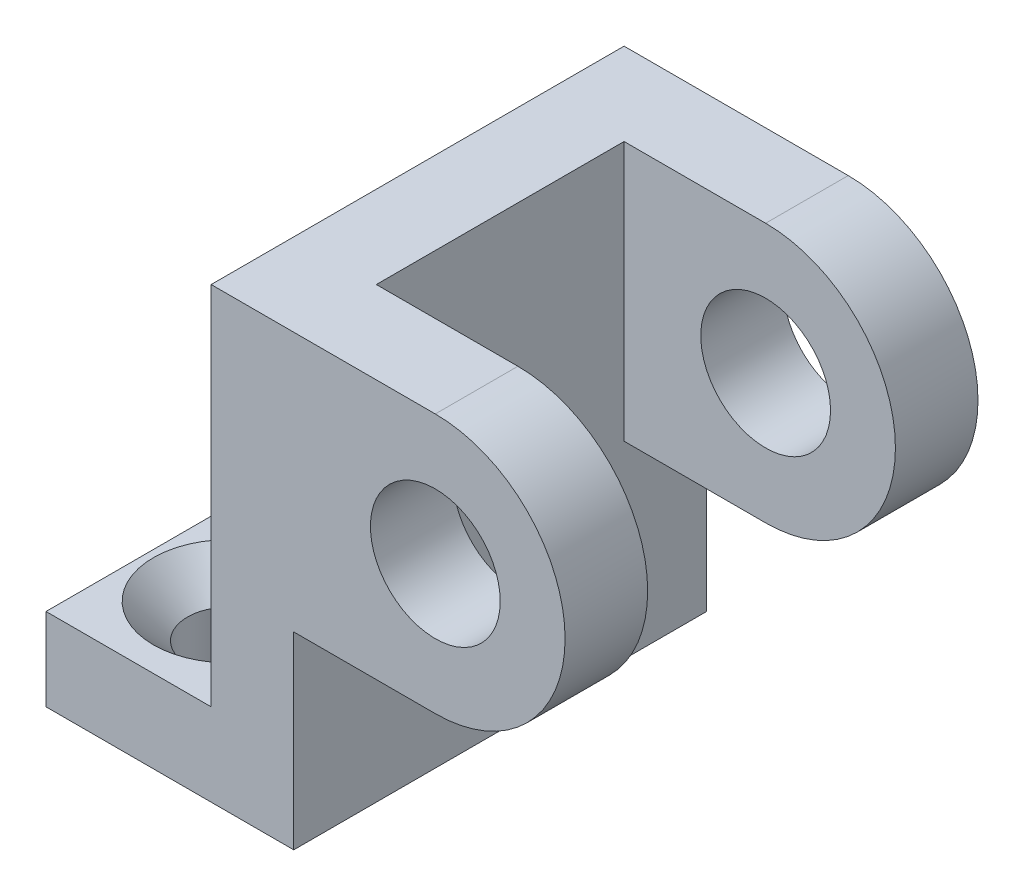
ISO-10303-21;
HEADER;
FILE_DESCRIPTION(('STEP AP214'),'2;1');
FILE_NAME('part.step','',(''),(''),'','','');
FILE_SCHEMA(('AUTOMOTIVE_DESIGN { 1 0 10303 214 1 1 1 1 }'));
ENDSEC;
DATA;
#1=APPLICATION_CONTEXT('core data for automotive mechanical design processes');
#2=APPLICATION_PROTOCOL_DEFINITION('international standard','automotive_design',2000,#1);
#3=PRODUCT_CONTEXT('',#1,'mechanical');
#4=PRODUCT('Part','Part','',(#3));
#5=PRODUCT_RELATED_PRODUCT_CATEGORY('part','',(#4));
#6=PRODUCT_DEFINITION_FORMATION('','',#4);
#7=PRODUCT_DEFINITION_CONTEXT('part definition',#1,'design');
#8=PRODUCT_DEFINITION('design','',#6,#7);
#9=PRODUCT_DEFINITION_SHAPE('','',#8);
#10=(LENGTH_UNIT() NAMED_UNIT(*) SI_UNIT(.MILLI.,.METRE.));
#11=(NAMED_UNIT(*) PLANE_ANGLE_UNIT() SI_UNIT($,.RADIAN.));
#12=(NAMED_UNIT(*) SI_UNIT($,.STERADIAN.) SOLID_ANGLE_UNIT());
#13=UNCERTAINTY_MEASURE_WITH_UNIT(LENGTH_MEASURE(1.E-05),#10,'distance_accuracy_value','');
#14=(GEOMETRIC_REPRESENTATION_CONTEXT(3) GLOBAL_UNCERTAINTY_ASSIGNED_CONTEXT((#13)) GLOBAL_UNIT_ASSIGNED_CONTEXT((#10,
#11,#12)) REPRESENTATION_CONTEXT('',''));
#15=CARTESIAN_POINT('',(0.,0.,0.));
#16=DIRECTION('',(0.,0.,1.));
#17=DIRECTION('',(1.,0.,0.));
#18=AXIS2_PLACEMENT_3D('',#15,#16,#17);
#19=CARTESIAN_POINT('',(14.,38.,-17.5));
#20=DIRECTION('',(-1.,0.,0.));
#21=DIRECTION('',(0.,0.,1.));
#22=AXIS2_PLACEMENT_3D('',#19,#20,#21);
#23=PLANE('',#22);
#24=DIRECTION('',(0.,-1.,0.));
#25=VECTOR('',#24,1.);
#26=CARTESIAN_POINT('',(14.,16.,-10.5));
#27=LINE('',#26,#25);
#28=CARTESIAN_POINT('',(14.,38.,-10.5));
#29=VERTEX_POINT('',#28);
#30=CARTESIAN_POINT('',(14.,16.,-10.5));
#31=VERTEX_POINT('',#30);
#32=EDGE_CURVE('E142',#29,#31,#27,.T.);
#33=ORIENTED_EDGE('',*,*,#32,.F.);
#34=DIRECTION('',(0.,0.,-1.));
#35=VECTOR('',#34,1.);
#36=CARTESIAN_POINT('',(14.,38.,-17.5));
#37=LINE('',#36,#35);
#38=CARTESIAN_POINT('',(14.,38.,10.5));
#39=VERTEX_POINT('',#38);
#40=EDGE_CURVE('E154',#39,#29,#37,.T.);
#41=ORIENTED_EDGE('',*,*,#40,.F.);
#42=DIRECTION('',(0.,-1.,0.));
#43=VECTOR('',#42,1.);
#44=CARTESIAN_POINT('',(14.,16.,10.5));
#45=LINE('',#44,#43);
#46=CARTESIAN_POINT('',(14.,16.,10.5));
#47=VERTEX_POINT('',#46);
#48=EDGE_CURVE('E241',#39,#47,#45,.T.);
#49=ORIENTED_EDGE('',*,*,#48,.T.);
#50=DIRECTION('',(0.,0.,1.));
#51=VECTOR('',#50,1.);
#52=CARTESIAN_POINT('',(14.,16.,10.5));
#53=LINE('',#52,#51);
#54=CARTESIAN_POINT('',(14.,16.,17.5));
#55=VERTEX_POINT('',#54);
#56=EDGE_CURVE('E173',#47,#55,#53,.T.);
#57=ORIENTED_EDGE('',*,*,#56,.T.);
#58=DIRECTION('',(0.,-1.,0.));
#59=VECTOR('',#58,1.);
#60=CARTESIAN_POINT('',(14.,38.,17.5));
#61=LINE('',#60,#59);
#62=CARTESIAN_POINT('',(14.,0.,17.5));
#63=VERTEX_POINT('',#62);
#64=EDGE_CURVE('E178',#55,#63,#61,.T.);
#65=ORIENTED_EDGE('',*,*,#64,.T.);
#66=DIRECTION('',(0.,0.,-1.));
#67=VECTOR('',#66,1.);
#68=CARTESIAN_POINT('',(14.,0.,-17.5));
#69=LINE('',#68,#67);
#70=CARTESIAN_POINT('',(14.,0.,-17.5));
#71=VERTEX_POINT('',#70);
#72=EDGE_CURVE('E165',#63,#71,#69,.T.);
#73=ORIENTED_EDGE('',*,*,#72,.T.);
#74=DIRECTION('',(0.,-1.,0.));
#75=VECTOR('',#74,1.);
#76=CARTESIAN_POINT('',(14.,38.,-17.5));
#77=LINE('',#76,#75);
#78=CARTESIAN_POINT('',(14.,16.,-17.5));
#79=VERTEX_POINT('',#78);
#80=EDGE_CURVE('E185',#79,#71,#77,.T.);
#81=ORIENTED_EDGE('',*,*,#80,.F.);
#82=DIRECTION('',(0.,0.,-1.));
#83=VECTOR('',#82,1.);
#84=CARTESIAN_POINT('',(14.,16.,-10.5));
#85=LINE('',#84,#83);
#86=EDGE_CURVE('E157',#31,#79,#85,.T.);
#87=ORIENTED_EDGE('',*,*,#86,.F.);
#88=EDGE_LOOP('',(#33,#41,#49,#57,#65,#73,#81,#87));
#89=FACE_BOUND('',#88,.T.);
#90=ADVANCED_FACE('F39',(#89),#23,.F.);
#91=CARTESIAN_POINT('',(-7.,7.,17.5));
#92=DIRECTION('',(1.,0.,0.));
#93=DIRECTION('',(0.,0.,-1.));
#94=AXIS2_PLACEMENT_3D('',#91,#92,#93);
#95=PLANE('',#94);
#96=DIRECTION('',(0.,0.,1.));
#97=VECTOR('',#96,1.);
#98=CARTESIAN_POINT('',(-7.,0.,17.5));
#99=LINE('',#98,#97);
#100=CARTESIAN_POINT('',(-7.,0.,-17.5));
#101=VERTEX_POINT('',#100);
#102=CARTESIAN_POINT('',(-7.,0.,17.5));
#103=VERTEX_POINT('',#102);
#104=EDGE_CURVE('E205',#101,#103,#99,.T.);
#105=ORIENTED_EDGE('',*,*,#104,.T.);
#106=DIRECTION('',(0.,-1.,0.));
#107=VECTOR('',#106,1.);
#108=CARTESIAN_POINT('',(-7.,7.,17.5));
#109=LINE('',#108,#107);
#110=CARTESIAN_POINT('',(-7.,7.,17.5));
#111=VERTEX_POINT('',#110);
#112=EDGE_CURVE('E11',#111,#103,#109,.T.);
#113=ORIENTED_EDGE('',*,*,#112,.F.);
#114=DIRECTION('',(0.,0.,1.));
#115=VECTOR('',#114,1.);
#116=CARTESIAN_POINT('',(-7.,7.,17.5));
#117=LINE('',#116,#115);
#118=CARTESIAN_POINT('',(-7.,7.,-17.5));
#119=VERTEX_POINT('',#118);
#120=EDGE_CURVE('E206',#119,#111,#117,.T.);
#121=ORIENTED_EDGE('',*,*,#120,.F.);
#122=DIRECTION('',(0.,-1.,0.));
#123=VECTOR('',#122,1.);
#124=CARTESIAN_POINT('',(-7.,7.,-17.5));
#125=LINE('',#124,#123);
#126=EDGE_CURVE('E47',#119,#101,#125,.T.);
#127=ORIENTED_EDGE('',*,*,#126,.T.);
#128=EDGE_LOOP('',(#105,#113,#121,#127));
#129=FACE_BOUND('',#128,.T.);
#130=ADVANCED_FACE('F41',(#129),#95,.F.);
#131=CARTESIAN_POINT('',(7.,7.,17.5));
#132=DIRECTION('',(0.,0.,-1.));
#133=DIRECTION('',(-1.,0.,0.));
#134=AXIS2_PLACEMENT_3D('',#131,#132,#133);
#135=PLANE('',#134);
#136=DIRECTION('',(1.,0.,0.));
#137=VECTOR('',#136,1.);
#138=CARTESIAN_POINT('',(7.,0.,17.5));
#139=LINE('',#138,#137);
#140=EDGE_CURVE('E214',#103,#63,#139,.T.);
#141=ORIENTED_EDGE('',*,*,#140,.T.);
#142=ORIENTED_EDGE('',*,*,#64,.F.);
#143=DIRECTION('',(1.,0.,0.));
#144=VECTOR('',#143,1.);
#145=CARTESIAN_POINT('',(14.,16.,17.5));
#146=LINE('',#145,#144);
#147=CARTESIAN_POINT('',(26.,16.,17.5));
#148=VERTEX_POINT('',#147);
#149=EDGE_CURVE('E54',#55,#148,#146,.T.);
#150=ORIENTED_EDGE('',*,*,#149,.T.);
#151=CARTESIAN_POINT('',(26.,27.,17.5));
#152=DIRECTION('',(0.,0.,1.));
#153=DIRECTION('',(1.,0.,0.));
#154=AXIS2_PLACEMENT_3D('',#151,#152,#153);
#155=CIRCLE('',#154,11.);
#156=CARTESIAN_POINT('',(26.,38.,17.5));
#157=VERTEX_POINT('',#156);
#158=EDGE_CURVE('E244',#148,#157,#155,.T.);
#159=ORIENTED_EDGE('',*,*,#158,.T.);
#160=DIRECTION('',(1.,0.,0.));
#161=VECTOR('',#160,1.);
#162=CARTESIAN_POINT('',(7.,38.,17.5));
#163=LINE('',#162,#161);
#164=CARTESIAN_POINT('',(7.,38.,17.5));
#165=VERTEX_POINT('',#164);
#166=EDGE_CURVE('E177',#165,#157,#163,.T.);
#167=ORIENTED_EDGE('',*,*,#166,.F.);
#168=DIRECTION('',(0.,-1.,0.));
#169=VECTOR('',#168,1.);
#170=CARTESIAN_POINT('',(7.,38.,17.5));
#171=LINE('',#170,#169);
#172=CARTESIAN_POINT('',(7.,7.,17.5));
#173=VERTEX_POINT('',#172);
#174=EDGE_CURVE('E181',#165,#173,#171,.T.);
#175=ORIENTED_EDGE('',*,*,#174,.T.);
#176=DIRECTION('',(1.,0.,0.));
#177=VECTOR('',#176,1.);
#178=CARTESIAN_POINT('',(7.,7.,17.5));
#179=LINE('',#178,#177);
#180=EDGE_CURVE('E84',#111,#173,#179,.T.);
#181=ORIENTED_EDGE('',*,*,#180,.F.);
#182=ORIENTED_EDGE('',*,*,#112,.T.);
#183=EDGE_LOOP('',(#141,#142,#150,#159,#167,#175,#181,#182));
#184=FACE_BOUND('',#183,.T.);
#185=CARTESIAN_POINT('',(26.,27.,17.5));
#186=DIRECTION('',(0.,0.,1.));
#187=DIRECTION('',(1.,0.,0.));
#188=AXIS2_PLACEMENT_3D('',#185,#186,#187);
#189=CIRCLE('',#188,5.5);
#190=CARTESIAN_POINT('',(31.5,27.,17.5));
#191=VERTEX_POINT('',#190);
#192=EDGE_CURVE('E231',#191,#191,#189,.T.);
#193=ORIENTED_EDGE('',*,*,#192,.F.);
#194=EDGE_LOOP('',(#193));
#195=FACE_BOUND('',#194,.T.);
#196=ADVANCED_FACE('F225',(#184,#195),#135,.F.);
#197=CARTESIAN_POINT('',(7.,7.,-17.5));
#198=DIRECTION('',(0.,0.,1.));
#199=DIRECTION('',(1.,0.,0.));
#200=AXIS2_PLACEMENT_3D('',#197,#198,#199);
#201=PLANE('',#200);
#202=DIRECTION('',(-1.,0.,0.));
#203=VECTOR('',#202,1.);
#204=CARTESIAN_POINT('',(7.,0.,-17.5));
#205=LINE('',#204,#203);
#206=EDGE_CURVE('E78',#71,#101,#205,.T.);
#207=ORIENTED_EDGE('',*,*,#206,.T.);
#208=ORIENTED_EDGE('',*,*,#126,.F.);
#209=DIRECTION('',(-1.,0.,0.));
#210=VECTOR('',#209,1.);
#211=CARTESIAN_POINT('',(7.,7.,-17.5));
#212=LINE('',#211,#210);
#213=CARTESIAN_POINT('',(7.,7.,-17.5));
#214=VERTEX_POINT('',#213);
#215=EDGE_CURVE('E63',#214,#119,#212,.T.);
#216=ORIENTED_EDGE('',*,*,#215,.F.);
#217=DIRECTION('',(0.,-1.,0.));
#218=VECTOR('',#217,1.);
#219=CARTESIAN_POINT('',(7.,38.,-17.5));
#220=LINE('',#219,#218);
#221=CARTESIAN_POINT('',(7.,38.,-17.5));
#222=VERTEX_POINT('',#221);
#223=EDGE_CURVE('E183',#222,#214,#220,.T.);
#224=ORIENTED_EDGE('',*,*,#223,.F.);
#225=DIRECTION('',(-1.,0.,0.));
#226=VECTOR('',#225,1.);
#227=CARTESIAN_POINT('',(7.,38.,-17.5));
#228=LINE('',#227,#226);
#229=CARTESIAN_POINT('',(26.,38.,-17.5));
#230=VERTEX_POINT('',#229);
#231=EDGE_CURVE('E164',#230,#222,#228,.T.);
#232=ORIENTED_EDGE('',*,*,#231,.F.);
#233=CARTESIAN_POINT('',(26.,27.,-17.5));
#234=DIRECTION('',(0.,0.,1.));
#235=DIRECTION('',(1.,0.,0.));
#236=AXIS2_PLACEMENT_3D('',#233,#234,#235);
#237=CIRCLE('',#236,11.);
#238=CARTESIAN_POINT('',(26.,16.,-17.5));
#239=VERTEX_POINT('',#238);
#240=EDGE_CURVE('E271',#239,#230,#237,.T.);
#241=ORIENTED_EDGE('',*,*,#240,.F.);
#242=DIRECTION('',(1.,0.,0.));
#243=VECTOR('',#242,1.);
#244=CARTESIAN_POINT('',(14.,16.,-17.5));
#245=LINE('',#244,#243);
#246=EDGE_CURVE('E158',#79,#239,#245,.T.);
#247=ORIENTED_EDGE('',*,*,#246,.F.);
#248=ORIENTED_EDGE('',*,*,#80,.T.);
#249=EDGE_LOOP('',(#207,#208,#216,#224,#232,#241,#247,#248));
#250=FACE_BOUND('',#249,.T.);
#251=CARTESIAN_POINT('',(26.,27.,-17.5));
#252=DIRECTION('',(0.,0.,1.));
#253=DIRECTION('',(1.,0.,0.));
#254=AXIS2_PLACEMENT_3D('',#251,#252,#253);
#255=CIRCLE('',#254,5.5);
#256=CARTESIAN_POINT('',(31.5,27.,-17.5));
#257=VERTEX_POINT('',#256);
#258=EDGE_CURVE('E285',#257,#257,#255,.T.);
#259=ORIENTED_EDGE('',*,*,#258,.T.);
#260=EDGE_LOOP('',(#259));
#261=FACE_BOUND('',#260,.T.);
#262=ADVANCED_FACE('F228',(#250,#261),#201,.F.);
#263=CARTESIAN_POINT('',(0.,7.,0.));
#264=DIRECTION('',(0.,1.,0.));
#265=DIRECTION('',(0.,0.,1.));
#266=AXIS2_PLACEMENT_3D('',#263,#264,#265);
#267=PLANE('',#266);
#268=CARTESIAN_POINT('',(0.,7.,-9.));
#269=DIRECTION('',(0.,1.,0.));
#270=DIRECTION('',(0.,0.,1.));
#271=AXIS2_PLACEMENT_3D('',#268,#269,#270);
#272=CIRCLE('',#271,6.4);
#273=CARTESIAN_POINT('',(0.,7.,-2.6));
#274=VERTEX_POINT('',#273);
#275=EDGE_CURVE('E187',#274,#274,#272,.T.);
#276=ORIENTED_EDGE('',*,*,#275,.F.);
#277=EDGE_LOOP('',(#276));
#278=FACE_BOUND('',#277,.T.);
#279=CARTESIAN_POINT('',(0.,7.,9.));
#280=DIRECTION('',(0.,1.,0.));
#281=DIRECTION('',(0.,0.,1.));
#282=AXIS2_PLACEMENT_3D('',#279,#280,#281);
#283=CIRCLE('',#282,6.4);
#284=CARTESIAN_POINT('',(0.,7.,15.4));
#285=VERTEX_POINT('',#284);
#286=EDGE_CURVE('E196',#285,#285,#283,.T.);
#287=ORIENTED_EDGE('',*,*,#286,.F.);
#288=EDGE_LOOP('',(#287));
#289=FACE_BOUND('',#288,.T.);
#290=ORIENTED_EDGE('',*,*,#120,.T.);
#291=ORIENTED_EDGE('',*,*,#180,.T.);
#292=DIRECTION('',(0.,0.,-1.));
#293=VECTOR('',#292,1.);
#294=CARTESIAN_POINT('',(7.,7.,17.5));
#295=LINE('',#294,#293);
#296=EDGE_CURVE('E209',#173,#214,#295,.T.);
#297=ORIENTED_EDGE('',*,*,#296,.T.);
#298=ORIENTED_EDGE('',*,*,#215,.T.);
#299=EDGE_LOOP('',(#290,#291,#297,#298));
#300=FACE_BOUND('',#299,.T.);
#301=ADVANCED_FACE('F267',(#278,#289,#300),#267,.T.);
#302=CARTESIAN_POINT('',(0.,0.,0.));
#303=DIRECTION('',(0.,1.,0.));
#304=DIRECTION('',(0.,0.,1.));
#305=AXIS2_PLACEMENT_3D('',#302,#303,#304);
#306=PLANE('',#305);
#307=CARTESIAN_POINT('',(0.,0.,-9.));
#308=DIRECTION('',(0.,1.,0.));
#309=DIRECTION('',(0.,0.,1.));
#310=AXIS2_PLACEMENT_3D('',#307,#308,#309);
#311=CIRCLE('',#310,3.5);
#312=CARTESIAN_POINT('',(0.,0.,-5.5));
#313=VERTEX_POINT('',#312);
#314=EDGE_CURVE('E193',#313,#313,#311,.T.);
#315=ORIENTED_EDGE('',*,*,#314,.T.);
#316=EDGE_LOOP('',(#315));
#317=FACE_BOUND('',#316,.T.);
#318=CARTESIAN_POINT('',(0.,0.,9.));
#319=DIRECTION('',(0.,1.,0.));
#320=DIRECTION('',(0.,0.,1.));
#321=AXIS2_PLACEMENT_3D('',#318,#319,#320);
#322=CIRCLE('',#321,3.5);
#323=CARTESIAN_POINT('',(0.,0.,12.5));
#324=VERTEX_POINT('',#323);
#325=EDGE_CURVE('E202',#324,#324,#322,.T.);
#326=ORIENTED_EDGE('',*,*,#325,.T.);
#327=EDGE_LOOP('',(#326));
#328=FACE_BOUND('',#327,.T.);
#329=ORIENTED_EDGE('',*,*,#104,.F.);
#330=ORIENTED_EDGE('',*,*,#206,.F.);
#331=ORIENTED_EDGE('',*,*,#72,.F.);
#332=ORIENTED_EDGE('',*,*,#140,.F.);
#333=EDGE_LOOP('',(#329,#330,#331,#332));
#334=FACE_BOUND('',#333,.T.);
#335=ADVANCED_FACE('F222',(#317,#328,#334),#306,.F.);
#336=CARTESIAN_POINT('',(0.,7.,9.));
#337=DIRECTION('',(0.,1.,0.));
#338=DIRECTION('',(0.,0.,1.));
#339=AXIS2_PLACEMENT_3D('',#336,#337,#338);
#340=CYLINDRICAL_SURFACE('',#339,3.5);
#341=ORIENTED_EDGE('',*,*,#325,.F.);
#342=EDGE_LOOP('',(#341));
#343=FACE_BOUND('',#342,.T.);
#344=CARTESIAN_POINT('',(0.,4.1,9.));
#345=DIRECTION('',(0.,1.,0.));
#346=DIRECTION('',(0.,0.,1.));
#347=AXIS2_PLACEMENT_3D('',#344,#345,#346);
#348=CIRCLE('',#347,3.5);
#349=CARTESIAN_POINT('',(0.,4.1,12.5));
#350=VERTEX_POINT('',#349);
#351=EDGE_CURVE('E199',#350,#350,#348,.T.);
#352=ORIENTED_EDGE('',*,*,#351,.T.);
#353=EDGE_LOOP('',(#352));
#354=FACE_BOUND('',#353,.T.);
#355=ADVANCED_FACE('F326',(#343,#354),#340,.F.);
#356=CARTESIAN_POINT('',(0.,7.,9.));
#357=DIRECTION('',(0.,1.,0.));
#358=DIRECTION('',(0.,0.,1.));
#359=AXIS2_PLACEMENT_3D('',#356,#357,#358);
#360=CONICAL_SURFACE('',#359,6.4,0.785398163397448);
#361=ORIENTED_EDGE('',*,*,#351,.F.);
#362=EDGE_LOOP('',(#361));
#363=FACE_BOUND('',#362,.T.);
#364=ORIENTED_EDGE('',*,*,#286,.T.);
#365=EDGE_LOOP('',(#364));
#366=FACE_BOUND('',#365,.T.);
#367=ADVANCED_FACE('F322',(#363,#366),#360,.F.);
#368=CARTESIAN_POINT('',(0.,7.,-9.));
#369=DIRECTION('',(0.,1.,0.));
#370=DIRECTION('',(0.,0.,1.));
#371=AXIS2_PLACEMENT_3D('',#368,#369,#370);
#372=CYLINDRICAL_SURFACE('',#371,3.5);
#373=ORIENTED_EDGE('',*,*,#314,.F.);
#374=EDGE_LOOP('',(#373));
#375=FACE_BOUND('',#374,.T.);
#376=CARTESIAN_POINT('',(0.,4.1,-9.));
#377=DIRECTION('',(0.,1.,0.));
#378=DIRECTION('',(0.,0.,1.));
#379=AXIS2_PLACEMENT_3D('',#376,#377,#378);
#380=CIRCLE('',#379,3.5);
#381=CARTESIAN_POINT('',(0.,4.1,-5.5));
#382=VERTEX_POINT('',#381);
#383=EDGE_CURVE('E190',#382,#382,#380,.T.);
#384=ORIENTED_EDGE('',*,*,#383,.T.);
#385=EDGE_LOOP('',(#384));
#386=FACE_BOUND('',#385,.T.);
#387=ADVANCED_FACE('F318',(#375,#386),#372,.F.);
#388=CARTESIAN_POINT('',(0.,7.,-9.));
#389=DIRECTION('',(0.,1.,0.));
#390=DIRECTION('',(0.,0.,1.));
#391=AXIS2_PLACEMENT_3D('',#388,#389,#390);
#392=CONICAL_SURFACE('',#391,6.4,0.785398163397448);
#393=ORIENTED_EDGE('',*,*,#383,.F.);
#394=EDGE_LOOP('',(#393));
#395=FACE_BOUND('',#394,.T.);
#396=ORIENTED_EDGE('',*,*,#275,.T.);
#397=EDGE_LOOP('',(#396));
#398=FACE_BOUND('',#397,.T.);
#399=ADVANCED_FACE('F315',(#395,#398),#392,.F.);
#400=CARTESIAN_POINT('',(7.,38.,-17.5));
#401=DIRECTION('',(1.,0.,0.));
#402=DIRECTION('',(0.,0.,-1.));
#403=AXIS2_PLACEMENT_3D('',#400,#401,#402);
#404=PLANE('',#403);
#405=ORIENTED_EDGE('',*,*,#296,.F.);
#406=ORIENTED_EDGE('',*,*,#174,.F.);
#407=DIRECTION('',(0.,0.,1.));
#408=VECTOR('',#407,1.);
#409=CARTESIAN_POINT('',(7.,38.,-17.5));
#410=LINE('',#409,#408);
#411=EDGE_CURVE('E167',#222,#165,#410,.T.);
#412=ORIENTED_EDGE('',*,*,#411,.F.);
#413=ORIENTED_EDGE('',*,*,#223,.T.);
#414=EDGE_LOOP('',(#405,#406,#412,#413));
#415=FACE_BOUND('',#414,.T.);
#416=ADVANCED_FACE('F266',(#415),#404,.F.);
#417=CARTESIAN_POINT('',(0.,38.,0.));
#418=DIRECTION('',(0.,1.,0.));
#419=DIRECTION('',(0.,0.,1.));
#420=AXIS2_PLACEMENT_3D('',#417,#418,#419);
#421=PLANE('',#420);
#422=ORIENTED_EDGE('',*,*,#166,.T.);
#423=DIRECTION('',(0.,0.,1.));
#424=VECTOR('',#423,1.);
#425=CARTESIAN_POINT('',(26.,38.,10.5));
#426=LINE('',#425,#424);
#427=CARTESIAN_POINT('',(26.,38.,10.5));
#428=VERTEX_POINT('',#427);
#429=EDGE_CURVE('E170',#428,#157,#426,.T.);
#430=ORIENTED_EDGE('',*,*,#429,.F.);
#431=DIRECTION('',(-1.,0.,0.));
#432=VECTOR('',#431,1.);
#433=CARTESIAN_POINT('',(14.,38.,10.5));
#434=LINE('',#433,#432);
#435=EDGE_CURVE('E163',#428,#39,#434,.T.);
#436=ORIENTED_EDGE('',*,*,#435,.T.);
#437=ORIENTED_EDGE('',*,*,#40,.T.);
#438=DIRECTION('',(-1.,0.,0.));
#439=VECTOR('',#438,1.);
#440=CARTESIAN_POINT('',(14.,38.,-10.5));
#441=LINE('',#440,#439);
#442=CARTESIAN_POINT('',(26.,38.,-10.5));
#443=VERTEX_POINT('',#442);
#444=EDGE_CURVE('E138',#443,#29,#441,.T.);
#445=ORIENTED_EDGE('',*,*,#444,.F.);
#446=DIRECTION('',(0.,0.,-1.));
#447=VECTOR('',#446,1.);
#448=CARTESIAN_POINT('',(26.,38.,-10.5));
#449=LINE('',#448,#447);
#450=EDGE_CURVE('E275',#443,#230,#449,.T.);
#451=ORIENTED_EDGE('',*,*,#450,.T.);
#452=ORIENTED_EDGE('',*,*,#231,.T.);
#453=ORIENTED_EDGE('',*,*,#411,.T.);
#454=EDGE_LOOP('',(#422,#430,#436,#437,#445,#451,#452,#453));
#455=FACE_BOUND('',#454,.T.);
#456=ADVANCED_FACE('F161',(#455),#421,.T.);
#457=CARTESIAN_POINT('',(26.,27.,10.5));
#458=DIRECTION('',(0.,0.,1.));
#459=DIRECTION('',(1.,0.,0.));
#460=AXIS2_PLACEMENT_3D('',#457,#458,#459);
#461=CYLINDRICAL_SURFACE('',#460,11.);
#462=ORIENTED_EDGE('',*,*,#158,.F.);
#463=DIRECTION('',(0.,0.,1.));
#464=VECTOR('',#463,1.);
#465=CARTESIAN_POINT('',(26.,16.,10.5));
#466=LINE('',#465,#464);
#467=CARTESIAN_POINT('',(26.,16.,10.5));
#468=VERTEX_POINT('',#467);
#469=EDGE_CURVE('E255',#468,#148,#466,.T.);
#470=ORIENTED_EDGE('',*,*,#469,.F.);
#471=CARTESIAN_POINT('',(26.,27.,10.5));
#472=DIRECTION('',(0.,0.,1.));
#473=DIRECTION('',(1.,0.,0.));
#474=AXIS2_PLACEMENT_3D('',#471,#472,#473);
#475=CIRCLE('',#474,11.);
#476=EDGE_CURVE('E247',#468,#428,#475,.T.);
#477=ORIENTED_EDGE('',*,*,#476,.T.);
#478=ORIENTED_EDGE('',*,*,#429,.T.);
#479=EDGE_LOOP('',(#462,#470,#477,#478));
#480=FACE_BOUND('',#479,.T.);
#481=ADVANCED_FACE('F260',(#480),#461,.T.);
#482=CARTESIAN_POINT('',(14.,16.,10.5));
#483=DIRECTION('',(0.,-1.,0.));
#484=DIRECTION('',(0.,0.,-1.));
#485=AXIS2_PLACEMENT_3D('',#482,#483,#484);
#486=PLANE('',#485);
#487=ORIENTED_EDGE('',*,*,#149,.F.);
#488=ORIENTED_EDGE('',*,*,#56,.F.);
#489=DIRECTION('',(1.,0.,0.));
#490=VECTOR('',#489,1.);
#491=CARTESIAN_POINT('',(14.,16.,10.5));
#492=LINE('',#491,#490);
#493=EDGE_CURVE('E243',#47,#468,#492,.T.);
#494=ORIENTED_EDGE('',*,*,#493,.T.);
#495=ORIENTED_EDGE('',*,*,#469,.T.);
#496=EDGE_LOOP('',(#487,#488,#494,#495));
#497=FACE_BOUND('',#496,.T.);
#498=ADVANCED_FACE('F383',(#497),#486,.T.);
#499=CARTESIAN_POINT('',(26.,27.,10.5));
#500=DIRECTION('',(0.,0.,1.));
#501=DIRECTION('',(1.,0.,0.));
#502=AXIS2_PLACEMENT_3D('',#499,#500,#501);
#503=PLANE('',#502);
#504=CARTESIAN_POINT('',(26.,27.,10.5));
#505=DIRECTION('',(0.,0.,1.));
#506=DIRECTION('',(1.,0.,0.));
#507=AXIS2_PLACEMENT_3D('',#504,#505,#506);
#508=CIRCLE('',#507,5.5);
#509=CARTESIAN_POINT('',(31.5,27.,10.5));
#510=VERTEX_POINT('',#509);
#511=EDGE_CURVE('E233',#510,#510,#508,.T.);
#512=ORIENTED_EDGE('',*,*,#511,.T.);
#513=EDGE_LOOP('',(#512));
#514=FACE_BOUND('',#513,.T.);
#515=ORIENTED_EDGE('',*,*,#48,.F.);
#516=ORIENTED_EDGE('',*,*,#435,.F.);
#517=ORIENTED_EDGE('',*,*,#476,.F.);
#518=ORIENTED_EDGE('',*,*,#493,.F.);
#519=EDGE_LOOP('',(#515,#516,#517,#518));
#520=FACE_BOUND('',#519,.T.);
#521=ADVANCED_FACE('F303',(#514,#520),#503,.F.);
#522=CARTESIAN_POINT('',(26.,27.,10.5));
#523=DIRECTION('',(0.,0.,1.));
#524=DIRECTION('',(1.,0.,0.));
#525=AXIS2_PLACEMENT_3D('',#522,#523,#524);
#526=CYLINDRICAL_SURFACE('',#525,5.5);
#527=ORIENTED_EDGE('',*,*,#511,.F.);
#528=EDGE_LOOP('',(#527));
#529=FACE_BOUND('',#528,.T.);
#530=ORIENTED_EDGE('',*,*,#192,.T.);
#531=EDGE_LOOP('',(#530));
#532=FACE_BOUND('',#531,.T.);
#533=ADVANCED_FACE('F295',(#529,#532),#526,.F.);
#534=CARTESIAN_POINT('',(26.,27.,-10.5));
#535=DIRECTION('',(0.,0.,-1.));
#536=DIRECTION('',(1.,0.,0.));
#537=AXIS2_PLACEMENT_3D('',#534,#535,#536);
#538=PLANE('',#537);
#539=ORIENTED_EDGE('',*,*,#32,.T.);
#540=DIRECTION('',(1.,0.,0.));
#541=VECTOR('',#540,1.);
#542=CARTESIAN_POINT('',(14.,16.,-10.5));
#543=LINE('',#542,#541);
#544=CARTESIAN_POINT('',(26.,16.,-10.5));
#545=VERTEX_POINT('',#544);
#546=EDGE_CURVE('E279',#31,#545,#543,.T.);
#547=ORIENTED_EDGE('',*,*,#546,.T.);
#548=CARTESIAN_POINT('',(26.,27.,-10.5));
#549=DIRECTION('',(0.,0.,1.));
#550=DIRECTION('',(1.,0.,0.));
#551=AXIS2_PLACEMENT_3D('',#548,#549,#550);
#552=CIRCLE('',#551,11.);
#553=EDGE_CURVE('E145',#545,#443,#552,.T.);
#554=ORIENTED_EDGE('',*,*,#553,.T.);
#555=ORIENTED_EDGE('',*,*,#444,.T.);
#556=EDGE_LOOP('',(#539,#547,#554,#555));
#557=FACE_BOUND('',#556,.T.);
#558=CARTESIAN_POINT('',(26.,27.,-10.5));
#559=DIRECTION('',(0.,0.,1.));
#560=DIRECTION('',(1.,0.,0.));
#561=AXIS2_PLACEMENT_3D('',#558,#559,#560);
#562=CIRCLE('',#561,5.5);
#563=CARTESIAN_POINT('',(31.5,27.,-10.5));
#564=VERTEX_POINT('',#563);
#565=EDGE_CURVE('E277',#564,#564,#562,.T.);
#566=ORIENTED_EDGE('',*,*,#565,.F.);
#567=EDGE_LOOP('',(#566));
#568=FACE_BOUND('',#567,.T.);
#569=ADVANCED_FACE('F140',(#557,#568),#538,.F.);
#570=CARTESIAN_POINT('',(14.,16.,-10.5));
#571=DIRECTION('',(0.,1.,0.));
#572=DIRECTION('',(0.,0.,1.));
#573=AXIS2_PLACEMENT_3D('',#570,#571,#572);
#574=PLANE('',#573);
#575=ORIENTED_EDGE('',*,*,#246,.T.);
#576=DIRECTION('',(0.,0.,-1.));
#577=VECTOR('',#576,1.);
#578=CARTESIAN_POINT('',(26.,16.,-10.5));
#579=LINE('',#578,#577);
#580=EDGE_CURVE('E237',#545,#239,#579,.T.);
#581=ORIENTED_EDGE('',*,*,#580,.F.);
#582=ORIENTED_EDGE('',*,*,#546,.F.);
#583=ORIENTED_EDGE('',*,*,#86,.T.);
#584=EDGE_LOOP('',(#575,#581,#582,#583));
#585=FACE_BOUND('',#584,.T.);
#586=ADVANCED_FACE('F294',(#585),#574,.F.);
#587=CARTESIAN_POINT('',(26.,27.,-10.5));
#588=DIRECTION('',(0.,0.,-1.));
#589=DIRECTION('',(-1.,0.,0.));
#590=AXIS2_PLACEMENT_3D('',#587,#588,#589);
#591=CYLINDRICAL_SURFACE('',#590,11.);
#592=ORIENTED_EDGE('',*,*,#240,.T.);
#593=ORIENTED_EDGE('',*,*,#450,.F.);
#594=ORIENTED_EDGE('',*,*,#553,.F.);
#595=ORIENTED_EDGE('',*,*,#580,.T.);
#596=EDGE_LOOP('',(#592,#593,#594,#595));
#597=FACE_BOUND('',#596,.T.);
#598=ADVANCED_FACE('F274',(#597),#591,.T.);
#599=CARTESIAN_POINT('',(26.,27.,-10.5));
#600=DIRECTION('',(0.,0.,-1.));
#601=DIRECTION('',(-1.,0.,0.));
#602=AXIS2_PLACEMENT_3D('',#599,#600,#601);
#603=CYLINDRICAL_SURFACE('',#602,5.5);
#604=ORIENTED_EDGE('',*,*,#565,.T.);
#605=EDGE_LOOP('',(#604));
#606=FACE_BOUND('',#605,.T.);
#607=ORIENTED_EDGE('',*,*,#258,.F.);
#608=EDGE_LOOP('',(#607));
#609=FACE_BOUND('',#608,.T.);
#610=ADVANCED_FACE('F291',(#606,#609),#603,.F.);
#611=CLOSED_SHELL('',(#90,#130,#196,#262,#301,#335,#355,#367,#387,#399,#416,#456,#481,#498,#521,
#533,#569,#586,#598,#610));
#612=MANIFOLD_SOLID_BREP('B2',#611);
#613=ADVANCED_BREP_SHAPE_REPRESENTATION('',(#18,#612),#14);
#614=SHAPE_DEFINITION_REPRESENTATION(#9,#613);
ENDSEC;
END-ISO-10303-21;
